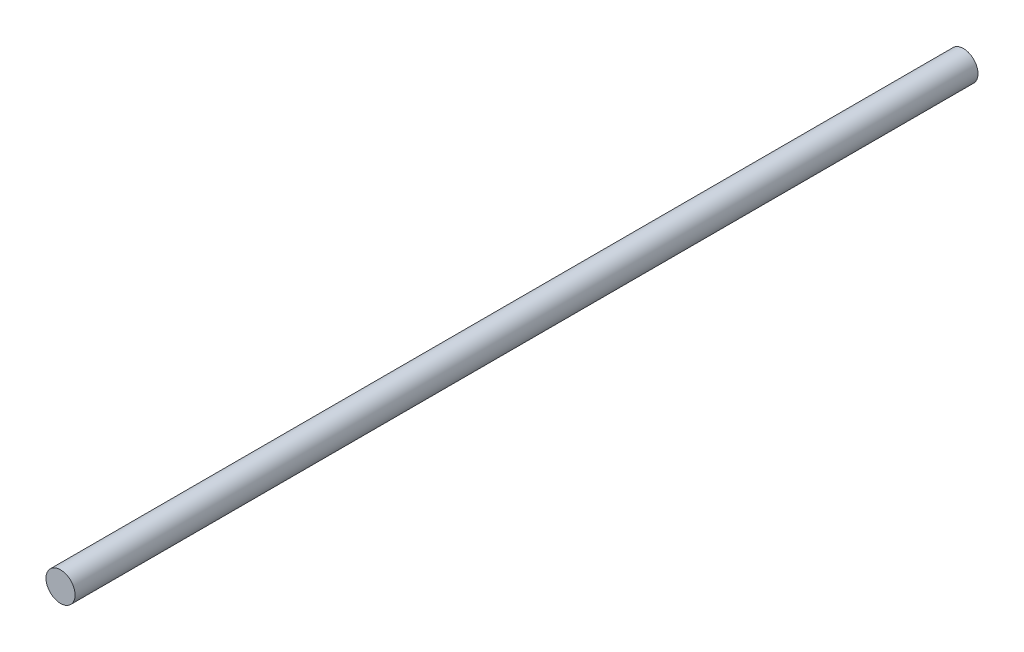
ISO-10303-21;
HEADER;
FILE_DESCRIPTION(('STEP AP214'),'2;1');
FILE_NAME('part.step','',(''),(''),'','','');
FILE_SCHEMA(('AUTOMOTIVE_DESIGN { 1 0 10303 214 1 1 1 1 }'));
ENDSEC;
DATA;
#1=APPLICATION_CONTEXT('core data for automotive mechanical design processes');
#2=APPLICATION_PROTOCOL_DEFINITION('international standard','automotive_design',2000,#1);
#3=PRODUCT_CONTEXT('',#1,'mechanical');
#4=PRODUCT('Part','Part','',(#3));
#5=PRODUCT_RELATED_PRODUCT_CATEGORY('part','',(#4));
#6=PRODUCT_DEFINITION_FORMATION('','',#4);
#7=PRODUCT_DEFINITION_CONTEXT('part definition',#1,'design');
#8=PRODUCT_DEFINITION('design','',#6,#7);
#9=PRODUCT_DEFINITION_SHAPE('','',#8);
#10=(LENGTH_UNIT() NAMED_UNIT(*) SI_UNIT(.MILLI.,.METRE.));
#11=(NAMED_UNIT(*) PLANE_ANGLE_UNIT() SI_UNIT($,.RADIAN.));
#12=(NAMED_UNIT(*) SI_UNIT($,.STERADIAN.) SOLID_ANGLE_UNIT());
#13=UNCERTAINTY_MEASURE_WITH_UNIT(LENGTH_MEASURE(1.E-05),#10,'distance_accuracy_value','');
#14=(GEOMETRIC_REPRESENTATION_CONTEXT(3) GLOBAL_UNCERTAINTY_ASSIGNED_CONTEXT((#13)) GLOBAL_UNIT_ASSIGNED_CONTEXT((#10,
#11,#12)) REPRESENTATION_CONTEXT('',''));
#15=CARTESIAN_POINT('',(0.,0.,0.));
#16=DIRECTION('',(0.,0.,1.));
#17=DIRECTION('',(1.,0.,0.));
#18=AXIS2_PLACEMENT_3D('',#15,#16,#17);
#19=CARTESIAN_POINT('',(0.,0.,310.));
#20=DIRECTION('',(0.,0.,-1.));
#21=DIRECTION('',(-1.,0.,0.));
#22=AXIS2_PLACEMENT_3D('',#19,#20,#21);
#23=CYLINDRICAL_SURFACE('',#22,5.);
#24=CARTESIAN_POINT('',(0.,0.,310.));
#25=DIRECTION('',(0.,0.,1.));
#26=DIRECTION('',(1.,0.,0.));
#27=AXIS2_PLACEMENT_3D('',#24,#25,#26);
#28=CIRCLE('',#27,5.);
#29=CARTESIAN_POINT('',(5.,0.,310.));
#30=VERTEX_POINT('',#29);
#31=EDGE_CURVE('E10',#30,#30,#28,.T.);
#32=ORIENTED_EDGE('',*,*,#31,.F.);
#33=EDGE_LOOP('',(#32));
#34=FACE_BOUND('',#33,.T.);
#35=CARTESIAN_POINT('',(0.,0.,0.));
#36=DIRECTION('',(0.,0.,1.));
#37=DIRECTION('',(1.,0.,0.));
#38=AXIS2_PLACEMENT_3D('',#35,#36,#37);
#39=CIRCLE('',#38,5.);
#40=CARTESIAN_POINT('',(5.,0.,0.));
#41=VERTEX_POINT('',#40);
#42=EDGE_CURVE('E37',#41,#41,#39,.T.);
#43=ORIENTED_EDGE('',*,*,#42,.T.);
#44=EDGE_LOOP('',(#43));
#45=FACE_BOUND('',#44,.T.);
#46=ADVANCED_FACE('F34',(#34,#45),#23,.T.);
#47=CARTESIAN_POINT('',(0.,0.,310.));
#48=DIRECTION('',(0.,0.,1.));
#49=DIRECTION('',(1.,0.,0.));
#50=AXIS2_PLACEMENT_3D('',#47,#48,#49);
#51=PLANE('',#50);
#52=ORIENTED_EDGE('',*,*,#31,.T.);
#53=EDGE_LOOP('',(#52));
#54=FACE_BOUND('',#53,.T.);
#55=ADVANCED_FACE('F49',(#54),#51,.T.);
#56=CARTESIAN_POINT('',(0.,0.,0.));
#57=DIRECTION('',(0.,0.,1.));
#58=DIRECTION('',(1.,0.,0.));
#59=AXIS2_PLACEMENT_3D('',#56,#57,#58);
#60=PLANE('',#59);
#61=ORIENTED_EDGE('',*,*,#42,.F.);
#62=EDGE_LOOP('',(#61));
#63=FACE_BOUND('',#62,.T.);
#64=ADVANCED_FACE('F47',(#63),#60,.F.);
#65=CLOSED_SHELL('',(#46,#55,#64));
#66=MANIFOLD_SOLID_BREP('B2',#65);
#67=ADVANCED_BREP_SHAPE_REPRESENTATION('',(#18,#66),#14);
#68=SHAPE_DEFINITION_REPRESENTATION(#9,#67);
ENDSEC;
END-ISO-10303-21;
